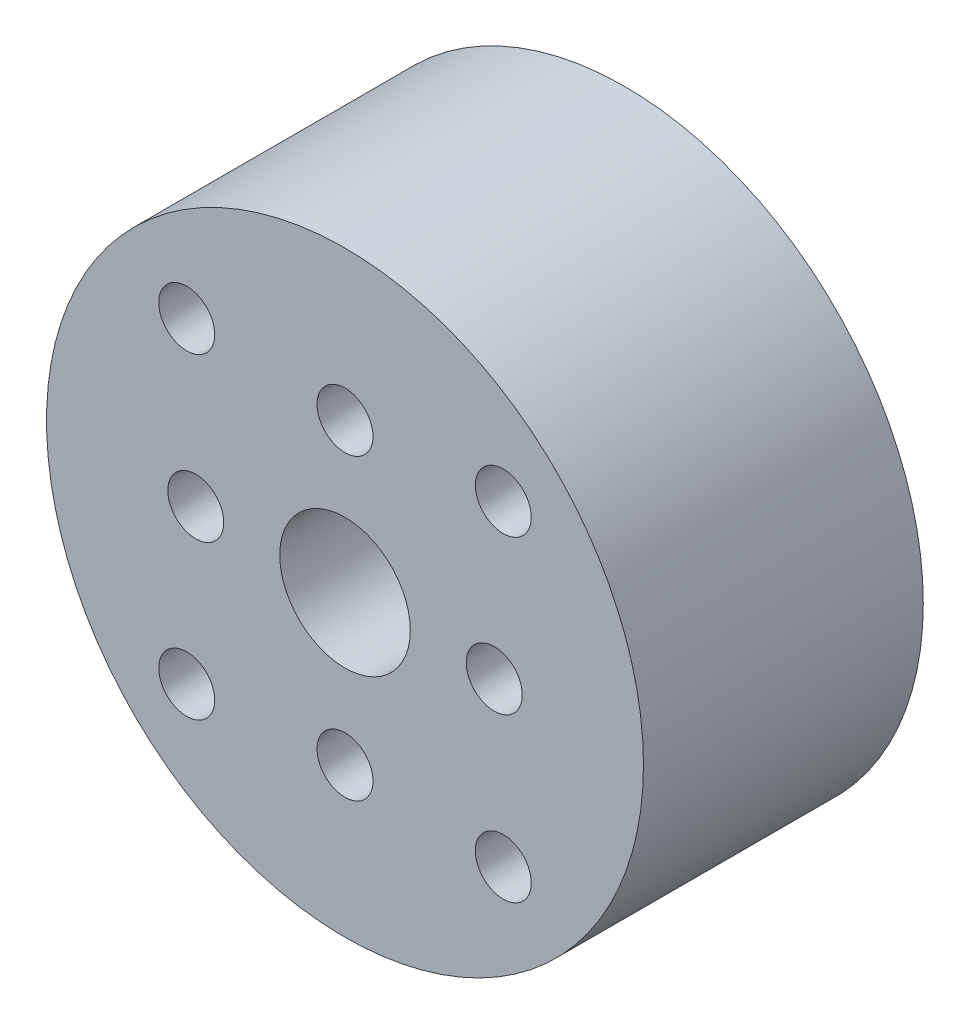
ISO-10303-21;
HEADER;
FILE_DESCRIPTION(('STEP AP214'),'2;1');
FILE_NAME('part.step','',(''),(''),'','','');
FILE_SCHEMA(('AUTOMOTIVE_DESIGN { 1 0 10303 214 1 1 1 1 }'));
ENDSEC;
DATA;
#1=APPLICATION_CONTEXT('core data for automotive mechanical design processes');
#2=APPLICATION_PROTOCOL_DEFINITION('international standard','automotive_design',2000,#1);
#3=PRODUCT_CONTEXT('',#1,'mechanical');
#4=PRODUCT('Part','Part','',(#3));
#5=PRODUCT_RELATED_PRODUCT_CATEGORY('part','',(#4));
#6=PRODUCT_DEFINITION_FORMATION('','',#4);
#7=PRODUCT_DEFINITION_CONTEXT('part definition',#1,'design');
#8=PRODUCT_DEFINITION('design','',#6,#7);
#9=PRODUCT_DEFINITION_SHAPE('','',#8);
#10=(LENGTH_UNIT() NAMED_UNIT(*) SI_UNIT(.MILLI.,.METRE.));
#11=(NAMED_UNIT(*) PLANE_ANGLE_UNIT() SI_UNIT($,.RADIAN.));
#12=(NAMED_UNIT(*) SI_UNIT($,.STERADIAN.) SOLID_ANGLE_UNIT());
#13=UNCERTAINTY_MEASURE_WITH_UNIT(LENGTH_MEASURE(1.E-05),#10,'distance_accuracy_value','');
#14=(GEOMETRIC_REPRESENTATION_CONTEXT(3) GLOBAL_UNCERTAINTY_ASSIGNED_CONTEXT((#13)) GLOBAL_UNIT_ASSIGNED_CONTEXT((#10,
#11,#12)) REPRESENTATION_CONTEXT('',''));
#15=CARTESIAN_POINT('',(0.,0.,0.));
#16=DIRECTION('',(0.,0.,1.));
#17=DIRECTION('',(1.,0.,0.));
#18=AXIS2_PLACEMENT_3D('',#15,#16,#17);
#19=CARTESIAN_POINT('',(0.,0.,15.));
#20=DIRECTION('',(0.,0.,1.));
#21=DIRECTION('',(1.,0.,0.));
#22=AXIS2_PLACEMENT_3D('',#19,#20,#21);
#23=PLANE('',#22);
#24=CARTESIAN_POINT('',(-8.48528137423809,-8.48528137423904,15.));
#25=DIRECTION('',(0.,0.,1.));
#26=DIRECTION('',(1.,0.,0.));
#27=AXIS2_PLACEMENT_3D('',#24,#25,#26);
#28=CIRCLE('',#27,1.50000000000036);
#29=CARTESIAN_POINT('',(-6.98528137423774,-8.48528137423904,15.));
#30=VERTEX_POINT('',#29);
#31=EDGE_CURVE('E86',#30,#30,#28,.T.);
#32=ORIENTED_EDGE('',*,*,#31,.F.);
#33=EDGE_LOOP('',(#32));
#34=FACE_BOUND('',#33,.T.);
#35=CARTESIAN_POINT('',(0.,0.,15.));
#36=DIRECTION('',(0.,0.,1.));
#37=DIRECTION('',(1.,0.,0.));
#38=AXIS2_PLACEMENT_3D('',#35,#36,#37);
#39=CIRCLE('',#38,3.5);
#40=CARTESIAN_POINT('',(3.5,0.,15.));
#41=VERTEX_POINT('',#40);
#42=EDGE_CURVE('E74',#41,#41,#39,.T.);
#43=ORIENTED_EDGE('',*,*,#42,.F.);
#44=EDGE_LOOP('',(#43));
#45=FACE_BOUND('',#44,.T.);
#46=CARTESIAN_POINT('',(4.52787916007828E-13,-8.,15.));
#47=DIRECTION('',(0.,0.,1.));
#48=DIRECTION('',(1.,0.,0.));
#49=AXIS2_PLACEMENT_3D('',#46,#47,#48);
#50=CIRCLE('',#49,1.50000000000049);
#51=CARTESIAN_POINT('',(1.50000000000094,-8.,15.));
#52=VERTEX_POINT('',#51);
#53=EDGE_CURVE('E62',#52,#52,#50,.T.);
#54=ORIENTED_EDGE('',*,*,#53,.F.);
#55=EDGE_LOOP('',(#54));
#56=FACE_BOUND('',#55,.T.);
#57=CARTESIAN_POINT('',(8.48528137423857,8.48528137423857,15.));
#58=DIRECTION('',(0.,0.,1.));
#59=DIRECTION('',(1.,0.,0.));
#60=AXIS2_PLACEMENT_3D('',#57,#58,#59);
#61=CIRCLE('',#60,1.5);
#62=CARTESIAN_POINT('',(9.98528137423857,8.48528137423857,15.));
#63=VERTEX_POINT('',#62);
#64=EDGE_CURVE('E50',#63,#63,#61,.T.);
#65=ORIENTED_EDGE('',*,*,#64,.F.);
#66=EDGE_LOOP('',(#65));
#67=FACE_BOUND('',#66,.T.);
#68=CARTESIAN_POINT('',(0.,0.,15.));
#69=DIRECTION('',(0.,0.,1.));
#70=DIRECTION('',(1.,0.,0.));
#71=AXIS2_PLACEMENT_3D('',#68,#69,#70);
#72=CIRCLE('',#71,16.);
#73=CARTESIAN_POINT('',(16.,0.,15.));
#74=VERTEX_POINT('',#73);
#75=EDGE_CURVE('E10',#74,#74,#72,.T.);
#76=ORIENTED_EDGE('',*,*,#75,.T.);
#77=EDGE_LOOP('',(#76));
#78=FACE_BOUND('',#77,.T.);
#79=CARTESIAN_POINT('',(0.,8.,15.));
#80=DIRECTION('',(0.,0.,1.));
#81=DIRECTION('',(1.,0.,0.));
#82=AXIS2_PLACEMENT_3D('',#79,#80,#81);
#83=CIRCLE('',#82,1.5);
#84=CARTESIAN_POINT('',(1.5,8.,15.));
#85=VERTEX_POINT('',#84);
#86=EDGE_CURVE('E45',#85,#85,#83,.T.);
#87=ORIENTED_EDGE('',*,*,#86,.F.);
#88=EDGE_LOOP('',(#87));
#89=FACE_BOUND('',#88,.T.);
#90=CARTESIAN_POINT('',(8.,0.,15.));
#91=DIRECTION('',(0.,0.,1.));
#92=DIRECTION('',(1.,0.,0.));
#93=AXIS2_PLACEMENT_3D('',#90,#91,#92);
#94=CIRCLE('',#93,1.5);
#95=CARTESIAN_POINT('',(9.5,0.,15.));
#96=VERTEX_POINT('',#95);
#97=EDGE_CURVE('E56',#96,#96,#94,.T.);
#98=ORIENTED_EDGE('',*,*,#97,.F.);
#99=EDGE_LOOP('',(#98));
#100=FACE_BOUND('',#99,.T.);
#101=CARTESIAN_POINT('',(-7.99999999999977,-2.27373675443232E-13,15.));
#102=DIRECTION('',(0.,0.,1.));
#103=DIRECTION('',(1.,0.,0.));
#104=AXIS2_PLACEMENT_3D('',#101,#102,#103);
#105=CIRCLE('',#104,1.50000000000036);
#106=CARTESIAN_POINT('',(-6.49999999999941,-2.27373675443232E-13,15.));
#107=VERTEX_POINT('',#106);
#108=EDGE_CURVE('E68',#107,#107,#105,.T.);
#109=ORIENTED_EDGE('',*,*,#108,.F.);
#110=EDGE_LOOP('',(#109));
#111=FACE_BOUND('',#110,.T.);
#112=CARTESIAN_POINT('',(8.48528137423904,-8.48528137423857,15.));
#113=DIRECTION('',(0.,0.,1.));
#114=DIRECTION('',(1.,0.,0.));
#115=AXIS2_PLACEMENT_3D('',#112,#113,#114);
#116=CIRCLE('',#115,1.49999999999988);
#117=CARTESIAN_POINT('',(9.98528137423892,-8.48528137423857,15.));
#118=VERTEX_POINT('',#117);
#119=EDGE_CURVE('E80',#118,#118,#116,.T.);
#120=ORIENTED_EDGE('',*,*,#119,.F.);
#121=EDGE_LOOP('',(#120));
#122=FACE_BOUND('',#121,.T.);
#123=CARTESIAN_POINT('',(-8.48528137423857,8.4852813742381,15.));
#124=DIRECTION('',(0.,0.,1.));
#125=DIRECTION('',(1.,0.,0.));
#126=AXIS2_PLACEMENT_3D('',#123,#124,#125);
#127=CIRCLE('',#126,1.50000000000051);
#128=CARTESIAN_POINT('',(-6.98528137423806,8.4852813742381,15.));
#129=VERTEX_POINT('',#128);
#130=EDGE_CURVE('E92',#129,#129,#127,.T.);
#131=ORIENTED_EDGE('',*,*,#130,.F.);
#132=EDGE_LOOP('',(#131));
#133=FACE_BOUND('',#132,.T.);
#134=ADVANCED_FACE('F34',(#34,#45,#56,#67,#78,#89,#100,#111,#122,#133),#23,.T.);
#135=CARTESIAN_POINT('',(0.,0.,0.));
#136=DIRECTION('',(0.,0.,1.));
#137=DIRECTION('',(1.,0.,0.));
#138=AXIS2_PLACEMENT_3D('',#135,#136,#137);
#139=PLANE('',#138);
#140=CARTESIAN_POINT('',(0.,0.,0.));
#141=DIRECTION('',(0.,0.,1.));
#142=DIRECTION('',(1.,0.,0.));
#143=AXIS2_PLACEMENT_3D('',#140,#141,#142);
#144=CIRCLE('',#143,16.);
#145=CARTESIAN_POINT('',(16.,0.,0.));
#146=VERTEX_POINT('',#145);
#147=EDGE_CURVE('E38',#146,#146,#144,.T.);
#148=ORIENTED_EDGE('',*,*,#147,.F.);
#149=EDGE_LOOP('',(#148));
#150=FACE_BOUND('',#149,.T.);
#151=CARTESIAN_POINT('',(0.,8.,0.));
#152=DIRECTION('',(0.,0.,1.));
#153=DIRECTION('',(1.,0.,0.));
#154=AXIS2_PLACEMENT_3D('',#151,#152,#153);
#155=CIRCLE('',#154,1.5);
#156=CARTESIAN_POINT('',(1.5,8.,0.));
#157=VERTEX_POINT('',#156);
#158=EDGE_CURVE('E47',#157,#157,#155,.T.);
#159=ORIENTED_EDGE('',*,*,#158,.T.);
#160=EDGE_LOOP('',(#159));
#161=FACE_BOUND('',#160,.T.);
#162=CARTESIAN_POINT('',(8.48528137423857,8.48528137423857,0.));
#163=DIRECTION('',(0.,0.,1.));
#164=DIRECTION('',(1.,0.,0.));
#165=AXIS2_PLACEMENT_3D('',#162,#163,#164);
#166=CIRCLE('',#165,1.5);
#167=CARTESIAN_POINT('',(9.98528137423857,8.48528137423857,0.));
#168=VERTEX_POINT('',#167);
#169=EDGE_CURVE('E53',#168,#168,#166,.T.);
#170=ORIENTED_EDGE('',*,*,#169,.T.);
#171=EDGE_LOOP('',(#170));
#172=FACE_BOUND('',#171,.T.);
#173=CARTESIAN_POINT('',(8.,0.,0.));
#174=DIRECTION('',(0.,0.,1.));
#175=DIRECTION('',(1.,0.,0.));
#176=AXIS2_PLACEMENT_3D('',#173,#174,#175);
#177=CIRCLE('',#176,1.5);
#178=CARTESIAN_POINT('',(9.5,0.,0.));
#179=VERTEX_POINT('',#178);
#180=EDGE_CURVE('E59',#179,#179,#177,.T.);
#181=ORIENTED_EDGE('',*,*,#180,.T.);
#182=EDGE_LOOP('',(#181));
#183=FACE_BOUND('',#182,.T.);
#184=CARTESIAN_POINT('',(4.52787916007828E-13,-8.,0.));
#185=DIRECTION('',(0.,0.,1.));
#186=DIRECTION('',(1.,0.,0.));
#187=AXIS2_PLACEMENT_3D('',#184,#185,#186);
#188=CIRCLE('',#187,1.50000000000049);
#189=CARTESIAN_POINT('',(1.50000000000094,-8.,0.));
#190=VERTEX_POINT('',#189);
#191=EDGE_CURVE('E65',#190,#190,#188,.T.);
#192=ORIENTED_EDGE('',*,*,#191,.T.);
#193=EDGE_LOOP('',(#192));
#194=FACE_BOUND('',#193,.T.);
#195=CARTESIAN_POINT('',(-7.99999999999977,-2.27373675443232E-13,0.));
#196=DIRECTION('',(0.,0.,1.));
#197=DIRECTION('',(1.,0.,0.));
#198=AXIS2_PLACEMENT_3D('',#195,#196,#197);
#199=CIRCLE('',#198,1.50000000000036);
#200=CARTESIAN_POINT('',(-6.49999999999941,-2.27373675443232E-13,0.));
#201=VERTEX_POINT('',#200);
#202=EDGE_CURVE('E71',#201,#201,#199,.T.);
#203=ORIENTED_EDGE('',*,*,#202,.T.);
#204=EDGE_LOOP('',(#203));
#205=FACE_BOUND('',#204,.T.);
#206=CARTESIAN_POINT('',(0.,0.,0.));
#207=DIRECTION('',(0.,0.,1.));
#208=DIRECTION('',(1.,0.,0.));
#209=AXIS2_PLACEMENT_3D('',#206,#207,#208);
#210=CIRCLE('',#209,3.5);
#211=CARTESIAN_POINT('',(3.5,0.,0.));
#212=VERTEX_POINT('',#211);
#213=EDGE_CURVE('E77',#212,#212,#210,.T.);
#214=ORIENTED_EDGE('',*,*,#213,.T.);
#215=EDGE_LOOP('',(#214));
#216=FACE_BOUND('',#215,.T.);
#217=CARTESIAN_POINT('',(8.48528137423904,-8.48528137423857,0.));
#218=DIRECTION('',(0.,0.,1.));
#219=DIRECTION('',(1.,0.,0.));
#220=AXIS2_PLACEMENT_3D('',#217,#218,#219);
#221=CIRCLE('',#220,1.49999999999988);
#222=CARTESIAN_POINT('',(9.98528137423892,-8.48528137423857,0.));
#223=VERTEX_POINT('',#222);
#224=EDGE_CURVE('E83',#223,#223,#221,.T.);
#225=ORIENTED_EDGE('',*,*,#224,.T.);
#226=EDGE_LOOP('',(#225));
#227=FACE_BOUND('',#226,.T.);
#228=CARTESIAN_POINT('',(-8.48528137423809,-8.48528137423904,0.));
#229=DIRECTION('',(0.,0.,1.));
#230=DIRECTION('',(1.,0.,0.));
#231=AXIS2_PLACEMENT_3D('',#228,#229,#230);
#232=CIRCLE('',#231,1.50000000000036);
#233=CARTESIAN_POINT('',(-6.98528137423774,-8.48528137423904,0.));
#234=VERTEX_POINT('',#233);
#235=EDGE_CURVE('E89',#234,#234,#232,.T.);
#236=ORIENTED_EDGE('',*,*,#235,.T.);
#237=EDGE_LOOP('',(#236));
#238=FACE_BOUND('',#237,.T.);
#239=CARTESIAN_POINT('',(-8.48528137423857,8.4852813742381,0.));
#240=DIRECTION('',(0.,0.,1.));
#241=DIRECTION('',(1.,0.,0.));
#242=AXIS2_PLACEMENT_3D('',#239,#240,#241);
#243=CIRCLE('',#242,1.50000000000051);
#244=CARTESIAN_POINT('',(-6.98528137423806,8.4852813742381,0.));
#245=VERTEX_POINT('',#244);
#246=EDGE_CURVE('E95',#245,#245,#243,.T.);
#247=ORIENTED_EDGE('',*,*,#246,.T.);
#248=EDGE_LOOP('',(#247));
#249=FACE_BOUND('',#248,.T.);
#250=ADVANCED_FACE('F105',(#150,#161,#172,#183,#194,#205,#216,#227,#238,#249),#139,.F.);
#251=CARTESIAN_POINT('',(0.,0.,15.));
#252=DIRECTION('',(0.,0.,-1.));
#253=DIRECTION('',(-1.,0.,0.));
#254=AXIS2_PLACEMENT_3D('',#251,#252,#253);
#255=CYLINDRICAL_SURFACE('',#254,16.);
#256=ORIENTED_EDGE('',*,*,#75,.F.);
#257=EDGE_LOOP('',(#256));
#258=FACE_BOUND('',#257,.T.);
#259=ORIENTED_EDGE('',*,*,#147,.T.);
#260=EDGE_LOOP('',(#259));
#261=FACE_BOUND('',#260,.T.);
#262=ADVANCED_FACE('F36',(#258,#261),#255,.T.);
#263=CARTESIAN_POINT('',(0.,8.,15.));
#264=DIRECTION('',(0.,0.,-1.));
#265=DIRECTION('',(-1.,0.,0.));
#266=AXIS2_PLACEMENT_3D('',#263,#264,#265);
#267=CYLINDRICAL_SURFACE('',#266,1.5);
#268=ORIENTED_EDGE('',*,*,#86,.T.);
#269=EDGE_LOOP('',(#268));
#270=FACE_BOUND('',#269,.T.);
#271=ORIENTED_EDGE('',*,*,#158,.F.);
#272=EDGE_LOOP('',(#271));
#273=FACE_BOUND('',#272,.T.);
#274=ADVANCED_FACE('F115',(#270,#273),#267,.F.);
#275=CARTESIAN_POINT('',(8.48528137423857,8.48528137423857,15.));
#276=DIRECTION('',(0.,0.,-1.));
#277=DIRECTION('',(-1.,0.,0.));
#278=AXIS2_PLACEMENT_3D('',#275,#276,#277);
#279=CYLINDRICAL_SURFACE('',#278,1.5);
#280=ORIENTED_EDGE('',*,*,#64,.T.);
#281=EDGE_LOOP('',(#280));
#282=FACE_BOUND('',#281,.T.);
#283=ORIENTED_EDGE('',*,*,#169,.F.);
#284=EDGE_LOOP('',(#283));
#285=FACE_BOUND('',#284,.T.);
#286=ADVANCED_FACE('F118',(#282,#285),#279,.F.);
#287=CARTESIAN_POINT('',(8.,0.,15.));
#288=DIRECTION('',(0.,0.,-1.));
#289=DIRECTION('',(-1.,0.,0.));
#290=AXIS2_PLACEMENT_3D('',#287,#288,#289);
#291=CYLINDRICAL_SURFACE('',#290,1.5);
#292=ORIENTED_EDGE('',*,*,#97,.T.);
#293=EDGE_LOOP('',(#292));
#294=FACE_BOUND('',#293,.T.);
#295=ORIENTED_EDGE('',*,*,#180,.F.);
#296=EDGE_LOOP('',(#295));
#297=FACE_BOUND('',#296,.T.);
#298=ADVANCED_FACE('F122',(#294,#297),#291,.F.);
#299=CARTESIAN_POINT('',(4.52787916007828E-13,-8.,15.));
#300=DIRECTION('',(0.,0.,-1.));
#301=DIRECTION('',(-1.,0.,0.));
#302=AXIS2_PLACEMENT_3D('',#299,#300,#301);
#303=CYLINDRICAL_SURFACE('',#302,1.50000000000049);
#304=ORIENTED_EDGE('',*,*,#53,.T.);
#305=EDGE_LOOP('',(#304));
#306=FACE_BOUND('',#305,.T.);
#307=ORIENTED_EDGE('',*,*,#191,.F.);
#308=EDGE_LOOP('',(#307));
#309=FACE_BOUND('',#308,.T.);
#310=ADVANCED_FACE('F126',(#306,#309),#303,.F.);
#311=CARTESIAN_POINT('',(-7.99999999999977,-2.27373675443232E-13,15.));
#312=DIRECTION('',(0.,0.,-1.));
#313=DIRECTION('',(-1.,0.,0.));
#314=AXIS2_PLACEMENT_3D('',#311,#312,#313);
#315=CYLINDRICAL_SURFACE('',#314,1.50000000000036);
#316=ORIENTED_EDGE('',*,*,#108,.T.);
#317=EDGE_LOOP('',(#316));
#318=FACE_BOUND('',#317,.T.);
#319=ORIENTED_EDGE('',*,*,#202,.F.);
#320=EDGE_LOOP('',(#319));
#321=FACE_BOUND('',#320,.T.);
#322=ADVANCED_FACE('F130',(#318,#321),#315,.F.);
#323=CARTESIAN_POINT('',(0.,0.,15.));
#324=DIRECTION('',(0.,0.,-1.));
#325=DIRECTION('',(-1.,0.,0.));
#326=AXIS2_PLACEMENT_3D('',#323,#324,#325);
#327=CYLINDRICAL_SURFACE('',#326,3.5);
#328=ORIENTED_EDGE('',*,*,#42,.T.);
#329=EDGE_LOOP('',(#328));
#330=FACE_BOUND('',#329,.T.);
#331=ORIENTED_EDGE('',*,*,#213,.F.);
#332=EDGE_LOOP('',(#331));
#333=FACE_BOUND('',#332,.T.);
#334=ADVANCED_FACE('F134',(#330,#333),#327,.F.);
#335=CARTESIAN_POINT('',(8.48528137423904,-8.48528137423857,15.));
#336=DIRECTION('',(0.,0.,-1.));
#337=DIRECTION('',(-1.,0.,0.));
#338=AXIS2_PLACEMENT_3D('',#335,#336,#337);
#339=CYLINDRICAL_SURFACE('',#338,1.49999999999988);
#340=ORIENTED_EDGE('',*,*,#119,.T.);
#341=EDGE_LOOP('',(#340));
#342=FACE_BOUND('',#341,.T.);
#343=ORIENTED_EDGE('',*,*,#224,.F.);
#344=EDGE_LOOP('',(#343));
#345=FACE_BOUND('',#344,.T.);
#346=ADVANCED_FACE('F138',(#342,#345),#339,.F.);
#347=CARTESIAN_POINT('',(-8.48528137423809,-8.48528137423904,15.));
#348=DIRECTION('',(0.,0.,-1.));
#349=DIRECTION('',(-1.,0.,0.));
#350=AXIS2_PLACEMENT_3D('',#347,#348,#349);
#351=CYLINDRICAL_SURFACE('',#350,1.50000000000036);
#352=ORIENTED_EDGE('',*,*,#31,.T.);
#353=EDGE_LOOP('',(#352));
#354=FACE_BOUND('',#353,.T.);
#355=ORIENTED_EDGE('',*,*,#235,.F.);
#356=EDGE_LOOP('',(#355));
#357=FACE_BOUND('',#356,.T.);
#358=ADVANCED_FACE('F142',(#354,#357),#351,.F.);
#359=CARTESIAN_POINT('',(-8.48528137423857,8.4852813742381,15.));
#360=DIRECTION('',(0.,0.,-1.));
#361=DIRECTION('',(-1.,0.,0.));
#362=AXIS2_PLACEMENT_3D('',#359,#360,#361);
#363=CYLINDRICAL_SURFACE('',#362,1.50000000000051);
#364=ORIENTED_EDGE('',*,*,#130,.T.);
#365=EDGE_LOOP('',(#364));
#366=FACE_BOUND('',#365,.T.);
#367=ORIENTED_EDGE('',*,*,#246,.F.);
#368=EDGE_LOOP('',(#367));
#369=FACE_BOUND('',#368,.T.);
#370=ADVANCED_FACE('F101',(#366,#369),#363,.F.);
#371=CLOSED_SHELL('',(#134,#250,#262,#274,#286,#298,#310,#322,#334,#346,#358,#370));
#372=MANIFOLD_SOLID_BREP('B2',#371);
#373=ADVANCED_BREP_SHAPE_REPRESENTATION('',(#18,#372),#14);
#374=SHAPE_DEFINITION_REPRESENTATION(#9,#373);
ENDSEC;
END-ISO-10303-21;
